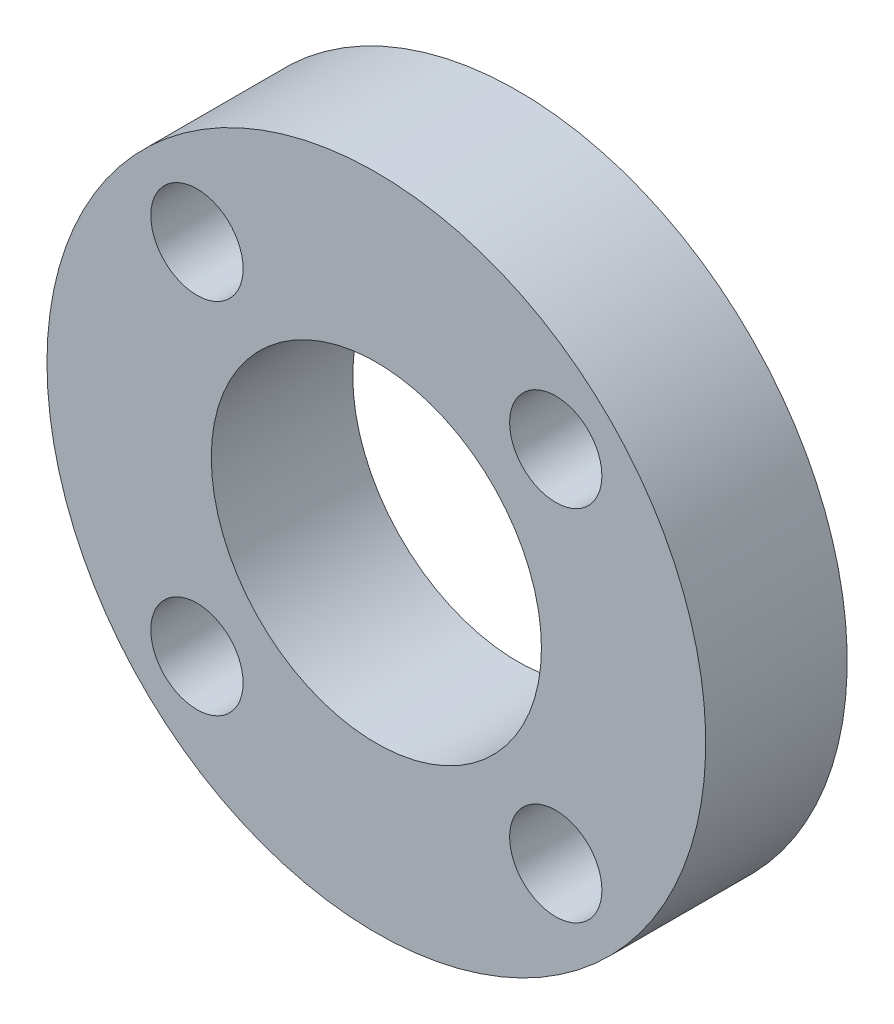
ISO-10303-21;
HEADER;
FILE_DESCRIPTION(('STEP AP214'),'2;1');
FILE_NAME('part.step','',(''),(''),'','','');
FILE_SCHEMA(('AUTOMOTIVE_DESIGN { 1 0 10303 214 1 1 1 1 }'));
ENDSEC;
DATA;
#1=APPLICATION_CONTEXT('core data for automotive mechanical design processes');
#2=APPLICATION_PROTOCOL_DEFINITION('international standard','automotive_design',2000,#1);
#3=PRODUCT_CONTEXT('',#1,'mechanical');
#4=PRODUCT('Part','Part','',(#3));
#5=PRODUCT_RELATED_PRODUCT_CATEGORY('part','',(#4));
#6=PRODUCT_DEFINITION_FORMATION('','',#4);
#7=PRODUCT_DEFINITION_CONTEXT('part definition',#1,'design');
#8=PRODUCT_DEFINITION('design','',#6,#7);
#9=PRODUCT_DEFINITION_SHAPE('','',#8);
#10=(LENGTH_UNIT() NAMED_UNIT(*) SI_UNIT(.MILLI.,.METRE.));
#11=(NAMED_UNIT(*) PLANE_ANGLE_UNIT() SI_UNIT($,.RADIAN.));
#12=(NAMED_UNIT(*) SI_UNIT($,.STERADIAN.) SOLID_ANGLE_UNIT());
#13=UNCERTAINTY_MEASURE_WITH_UNIT(LENGTH_MEASURE(1.E-05),#10,'distance_accuracy_value','');
#14=(GEOMETRIC_REPRESENTATION_CONTEXT(3) GLOBAL_UNCERTAINTY_ASSIGNED_CONTEXT((#13)) GLOBAL_UNIT_ASSIGNED_CONTEXT((#10,
#11,#12)) REPRESENTATION_CONTEXT('',''));
#15=CARTESIAN_POINT('',(0.,0.,0.));
#16=DIRECTION('',(0.,0.,1.));
#17=DIRECTION('',(1.,0.,0.));
#18=AXIS2_PLACEMENT_3D('',#15,#16,#17);
#19=CARTESIAN_POINT('',(0.,0.,6.35));
#20=DIRECTION('',(0.,0.,-1.));
#21=DIRECTION('',(-1.,0.,0.));
#22=AXIS2_PLACEMENT_3D('',#19,#20,#21);
#23=CYLINDRICAL_SURFACE('',#22,12.69619);
#24=CARTESIAN_POINT('',(0.,0.,6.35));
#25=DIRECTION('',(0.,0.,-1.));
#26=DIRECTION('',(-1.,0.,0.));
#27=AXIS2_PLACEMENT_3D('',#24,#25,#26);
#28=CIRCLE('',#27,12.69619);
#29=CARTESIAN_POINT('',(-12.69619,0.,6.35));
#30=VERTEX_POINT('',#29);
#31=EDGE_CURVE('E12',#30,#30,#28,.T.);
#32=ORIENTED_EDGE('',*,*,#31,.T.);
#33=EDGE_LOOP('',(#32));
#34=FACE_BOUND('',#33,.T.);
#35=CARTESIAN_POINT('',(0.,0.,0.896619238));
#36=DIRECTION('',(0.,0.,-1.));
#37=DIRECTION('',(-1.,0.,0.));
#38=AXIS2_PLACEMENT_3D('',#35,#36,#37);
#39=CIRCLE('',#38,12.69619);
#40=CARTESIAN_POINT('',(-12.69619,0.,0.896619238));
#41=VERTEX_POINT('',#40);
#42=EDGE_CURVE('E388',#41,#41,#39,.F.);
#43=ORIENTED_EDGE('',*,*,#42,.T.);
#44=EDGE_LOOP('',(#43));
#45=FACE_BOUND('',#44,.T.);
#46=ADVANCED_FACE('F54',(#34,#45),#23,.T.);
#47=CARTESIAN_POINT('',(0.,0.,0.));
#48=DIRECTION('',(0.,0.,-1.));
#49=DIRECTION('',(-1.,0.,0.));
#50=AXIS2_PLACEMENT_3D('',#47,#48,#49);
#51=CYLINDRICAL_SURFACE('',#50,6.36270000000001);
#52=CARTESIAN_POINT('',(0.,0.,6.35));
#53=DIRECTION('',(0.,0.,1.));
#54=DIRECTION('',(1.,0.,0.));
#55=AXIS2_PLACEMENT_3D('',#52,#53,#54);
#56=CIRCLE('',#55,6.36270000000001);
#57=CARTESIAN_POINT('',(6.36270000000001,0.,6.35));
#58=VERTEX_POINT('',#57);
#59=EDGE_CURVE('E64',#58,#58,#56,.T.);
#60=ORIENTED_EDGE('',*,*,#59,.T.);
#61=EDGE_LOOP('',(#60));
#62=FACE_BOUND('',#61,.T.);
#63=CARTESIAN_POINT('',(0.,0.,0.896619238));
#64=DIRECTION('',(0.,0.,-1.));
#65=DIRECTION('',(-1.,0.,0.));
#66=AXIS2_PLACEMENT_3D('',#63,#64,#65);
#67=CIRCLE('',#66,6.36270000000001);
#68=CARTESIAN_POINT('',(-6.36270000000001,0.,0.896619238));
#69=VERTEX_POINT('',#68);
#70=EDGE_CURVE('E391',#69,#69,#67,.F.);
#71=ORIENTED_EDGE('',*,*,#70,.F.);
#72=EDGE_LOOP('',(#71));
#73=FACE_BOUND('',#72,.T.);
#74=ADVANCED_FACE('F424',(#62,#73),#51,.F.);
#75=CARTESIAN_POINT('',(-6.91479721322323,6.91479721322326,0.));
#76=DIRECTION('',(0.,0.,-1.));
#77=DIRECTION('',(-1.,0.,0.));
#78=AXIS2_PLACEMENT_3D('',#75,#76,#77);
#79=CYLINDRICAL_SURFACE('',#78,1.77799999999998);
#80=CARTESIAN_POINT('',(-6.91479721322323,6.91479721322326,6.35));
#81=DIRECTION('',(0.,0.,1.));
#82=DIRECTION('',(1.,0.,0.));
#83=AXIS2_PLACEMENT_3D('',#80,#81,#82);
#84=CIRCLE('',#83,1.77799999999998);
#85=CARTESIAN_POINT('',(-5.13679721322325,6.91479721322326,6.35));
#86=VERTEX_POINT('',#85);
#87=EDGE_CURVE('E71',#86,#86,#84,.T.);
#88=ORIENTED_EDGE('',*,*,#87,.T.);
#89=EDGE_LOOP('',(#88));
#90=FACE_BOUND('',#89,.T.);
#91=CARTESIAN_POINT('',(-6.91479721322323,6.91479721322326,0.896619238));
#92=DIRECTION('',(0.,0.,-1.));
#93=DIRECTION('',(-1.,0.,0.));
#94=AXIS2_PLACEMENT_3D('',#91,#92,#93);
#95=CIRCLE('',#94,1.77799999999998);
#96=CARTESIAN_POINT('',(-8.69279721322322,6.91479721322326,0.896619238));
#97=VERTEX_POINT('',#96);
#98=EDGE_CURVE('E394',#97,#97,#95,.F.);
#99=ORIENTED_EDGE('',*,*,#98,.F.);
#100=EDGE_LOOP('',(#99));
#101=FACE_BOUND('',#100,.T.);
#102=ADVANCED_FACE('F428',(#90,#101),#79,.F.);
#103=CARTESIAN_POINT('',(6.91479721322328,6.91479721322321,0.));
#104=DIRECTION('',(0.,0.,-1.));
#105=DIRECTION('',(-1.,0.,0.));
#106=AXIS2_PLACEMENT_3D('',#103,#104,#105);
#107=CYLINDRICAL_SURFACE('',#106,1.77799999999998);
#108=CARTESIAN_POINT('',(6.91479721322328,6.91479721322321,6.35));
#109=DIRECTION('',(0.,0.,1.));
#110=DIRECTION('',(1.,0.,0.));
#111=AXIS2_PLACEMENT_3D('',#108,#109,#110);
#112=CIRCLE('',#111,1.77799999999998);
#113=CARTESIAN_POINT('',(8.69279721322327,6.91479721322321,6.35));
#114=VERTEX_POINT('',#113);
#115=EDGE_CURVE('E379',#114,#114,#112,.T.);
#116=ORIENTED_EDGE('',*,*,#115,.T.);
#117=EDGE_LOOP('',(#116));
#118=FACE_BOUND('',#117,.T.);
#119=CARTESIAN_POINT('',(6.91479721322328,6.91479721322321,0.896619238));
#120=DIRECTION('',(0.,0.,-1.));
#121=DIRECTION('',(-1.,0.,0.));
#122=AXIS2_PLACEMENT_3D('',#119,#120,#121);
#123=CIRCLE('',#122,1.77799999999998);
#124=CARTESIAN_POINT('',(5.1367972132233,6.91479721322321,0.896619238));
#125=VERTEX_POINT('',#124);
#126=EDGE_CURVE('E397',#125,#125,#123,.F.);
#127=ORIENTED_EDGE('',*,*,#126,.F.);
#128=EDGE_LOOP('',(#127));
#129=FACE_BOUND('',#128,.T.);
#130=ADVANCED_FACE('F419',(#118,#129),#107,.F.);
#131=CARTESIAN_POINT('',(6.91479721322323,-6.91479721322326,0.));
#132=DIRECTION('',(0.,0.,-1.));
#133=DIRECTION('',(-1.,0.,0.));
#134=AXIS2_PLACEMENT_3D('',#131,#132,#133);
#135=CYLINDRICAL_SURFACE('',#134,1.77799999999998);
#136=CARTESIAN_POINT('',(6.91479721322323,-6.91479721322326,6.35));
#137=DIRECTION('',(0.,0.,1.));
#138=DIRECTION('',(1.,0.,0.));
#139=AXIS2_PLACEMENT_3D('',#136,#137,#138);
#140=CIRCLE('',#139,1.77799999999998);
#141=CARTESIAN_POINT('',(8.69279721322322,-6.91479721322326,6.35));
#142=VERTEX_POINT('',#141);
#143=EDGE_CURVE('E382',#142,#142,#140,.T.);
#144=ORIENTED_EDGE('',*,*,#143,.T.);
#145=EDGE_LOOP('',(#144));
#146=FACE_BOUND('',#145,.T.);
#147=CARTESIAN_POINT('',(6.91479721322323,-6.91479721322326,0.896619238));
#148=DIRECTION('',(0.,0.,-1.));
#149=DIRECTION('',(-1.,0.,0.));
#150=AXIS2_PLACEMENT_3D('',#147,#148,#149);
#151=CIRCLE('',#150,1.77799999999998);
#152=CARTESIAN_POINT('',(5.13679721322325,-6.91479721322326,0.896619238));
#153=VERTEX_POINT('',#152);
#154=EDGE_CURVE('E400',#153,#153,#151,.F.);
#155=ORIENTED_EDGE('',*,*,#154,.F.);
#156=EDGE_LOOP('',(#155));
#157=FACE_BOUND('',#156,.T.);
#158=ADVANCED_FACE('F411',(#146,#157),#135,.F.);
#159=CARTESIAN_POINT('',(-6.91479721322333,-6.91479721322316,0.));
#160=DIRECTION('',(0.,0.,-1.));
#161=DIRECTION('',(-1.,0.,0.));
#162=AXIS2_PLACEMENT_3D('',#159,#160,#161);
#163=CYLINDRICAL_SURFACE('',#162,1.77799999999998);
#164=CARTESIAN_POINT('',(-6.91479721322333,-6.91479721322316,6.35));
#165=DIRECTION('',(0.,0.,1.));
#166=DIRECTION('',(1.,0.,0.));
#167=AXIS2_PLACEMENT_3D('',#164,#165,#166);
#168=CIRCLE('',#167,1.77799999999998);
#169=CARTESIAN_POINT('',(-5.13679721322335,-6.91479721322316,6.35));
#170=VERTEX_POINT('',#169);
#171=EDGE_CURVE('E385',#170,#170,#168,.T.);
#172=ORIENTED_EDGE('',*,*,#171,.T.);
#173=EDGE_LOOP('',(#172));
#174=FACE_BOUND('',#173,.T.);
#175=CARTESIAN_POINT('',(-6.91479721322333,-6.91479721322316,0.896619238));
#176=DIRECTION('',(0.,0.,-1.));
#177=DIRECTION('',(-1.,0.,0.));
#178=AXIS2_PLACEMENT_3D('',#175,#176,#177);
#179=CIRCLE('',#178,1.77799999999998);
#180=CARTESIAN_POINT('',(-8.69279721322332,-6.91479721322316,0.896619238));
#181=VERTEX_POINT('',#180);
#182=EDGE_CURVE('E59',#181,#181,#179,.F.);
#183=ORIENTED_EDGE('',*,*,#182,.F.);
#184=EDGE_LOOP('',(#183));
#185=FACE_BOUND('',#184,.T.);
#186=ADVANCED_FACE('F409',(#174,#185),#163,.F.);
#187=CARTESIAN_POINT('',(0.,0.,6.35));
#188=DIRECTION('',(0.,0.,1.));
#189=DIRECTION('',(1.,0.,0.));
#190=AXIS2_PLACEMENT_3D('',#187,#188,#189);
#191=PLANE('',#190);
#192=ORIENTED_EDGE('',*,*,#171,.F.);
#193=EDGE_LOOP('',(#192));
#194=FACE_BOUND('',#193,.T.);
#195=ORIENTED_EDGE('',*,*,#143,.F.);
#196=EDGE_LOOP('',(#195));
#197=FACE_BOUND('',#196,.T.);
#198=ORIENTED_EDGE('',*,*,#115,.F.);
#199=EDGE_LOOP('',(#198));
#200=FACE_BOUND('',#199,.T.);
#201=ORIENTED_EDGE('',*,*,#87,.F.);
#202=EDGE_LOOP('',(#201));
#203=FACE_BOUND('',#202,.T.);
#204=ORIENTED_EDGE('',*,*,#59,.F.);
#205=EDGE_LOOP('',(#204));
#206=FACE_BOUND('',#205,.T.);
#207=ORIENTED_EDGE('',*,*,#31,.F.);
#208=EDGE_LOOP('',(#207));
#209=FACE_BOUND('',#208,.T.);
#210=ADVANCED_FACE('F56',(#194,#197,#200,#203,#206,#209),#191,.T.);
#211=CARTESIAN_POINT('',(0.,0.,0.896619238));
#212=DIRECTION('',(0.,0.,-1.));
#213=DIRECTION('',(-1.,0.,0.));
#214=AXIS2_PLACEMENT_3D('',#211,#212,#213);
#215=PLANE('',#214);
#216=ORIENTED_EDGE('',*,*,#42,.F.);
#217=EDGE_LOOP('',(#216));
#218=FACE_BOUND('',#217,.T.);
#219=ORIENTED_EDGE('',*,*,#182,.T.);
#220=EDGE_LOOP('',(#219));
#221=FACE_BOUND('',#220,.T.);
#222=ORIENTED_EDGE('',*,*,#154,.T.);
#223=EDGE_LOOP('',(#222));
#224=FACE_BOUND('',#223,.T.);
#225=ORIENTED_EDGE('',*,*,#126,.T.);
#226=EDGE_LOOP('',(#225));
#227=FACE_BOUND('',#226,.T.);
#228=ORIENTED_EDGE('',*,*,#98,.T.);
#229=EDGE_LOOP('',(#228));
#230=FACE_BOUND('',#229,.T.);
#231=ORIENTED_EDGE('',*,*,#70,.T.);
#232=EDGE_LOOP('',(#231));
#233=FACE_BOUND('',#232,.T.);
#234=ADVANCED_FACE('F407',(#218,#221,#224,#227,#230,#233),#215,.T.);
#235=CLOSED_SHELL('',(#46,#74,#102,#130,#158,#186,#210,#234));
#236=MANIFOLD_SOLID_BREP('B2',#235);
#237=ADVANCED_BREP_SHAPE_REPRESENTATION('',(#18,#236),#14);
#238=SHAPE_DEFINITION_REPRESENTATION(#9,#237);
ENDSEC;
END-ISO-10303-21;
